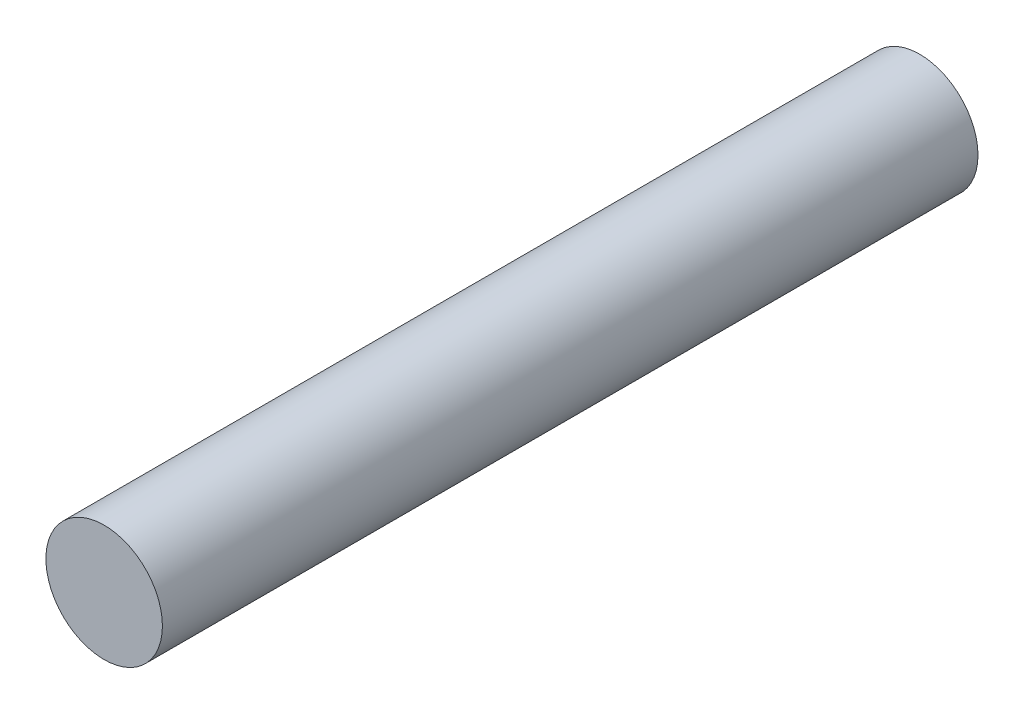
ISO-10303-21;
HEADER;
FILE_DESCRIPTION(('STEP AP214'),'2;1');
FILE_NAME('part.step','',(''),(''),'','','');
FILE_SCHEMA(('AUTOMOTIVE_DESIGN { 1 0 10303 214 1 1 1 1 }'));
ENDSEC;
DATA;
#1=APPLICATION_CONTEXT('core data for automotive mechanical design processes');
#2=APPLICATION_PROTOCOL_DEFINITION('international standard','automotive_design',2000,#1);
#3=PRODUCT_CONTEXT('',#1,'mechanical');
#4=PRODUCT('Part','Part','',(#3));
#5=PRODUCT_RELATED_PRODUCT_CATEGORY('part','',(#4));
#6=PRODUCT_DEFINITION_FORMATION('','',#4);
#7=PRODUCT_DEFINITION_CONTEXT('part definition',#1,'design');
#8=PRODUCT_DEFINITION('design','',#6,#7);
#9=PRODUCT_DEFINITION_SHAPE('','',#8);
#10=(LENGTH_UNIT() NAMED_UNIT(*) SI_UNIT(.MILLI.,.METRE.));
#11=(NAMED_UNIT(*) PLANE_ANGLE_UNIT() SI_UNIT($,.RADIAN.));
#12=(NAMED_UNIT(*) SI_UNIT($,.STERADIAN.) SOLID_ANGLE_UNIT());
#13=UNCERTAINTY_MEASURE_WITH_UNIT(LENGTH_MEASURE(1.E-05),#10,'distance_accuracy_value','');
#14=(GEOMETRIC_REPRESENTATION_CONTEXT(3) GLOBAL_UNCERTAINTY_ASSIGNED_CONTEXT((#13)) GLOBAL_UNIT_ASSIGNED_CONTEXT((#10,
#11,#12)) REPRESENTATION_CONTEXT('',''));
#15=CARTESIAN_POINT('',(0.,0.,0.));
#16=DIRECTION('',(0.,0.,1.));
#17=DIRECTION('',(1.,0.,0.));
#18=AXIS2_PLACEMENT_3D('',#15,#16,#17);
#19=CARTESIAN_POINT('',(0.,0.,42.));
#20=DIRECTION('',(0.,0.,-1.));
#21=DIRECTION('',(0.,-1.,0.));
#22=AXIS2_PLACEMENT_3D('',#19,#20,#21);
#23=CYLINDRICAL_SURFACE('',#22,3.);
#24=CARTESIAN_POINT('',(0.,0.,42.));
#25=DIRECTION('',(0.,0.,1.));
#26=DIRECTION('',(1.,0.,0.));
#27=AXIS2_PLACEMENT_3D('',#24,#25,#26);
#28=CIRCLE('',#27,3.);
#29=CARTESIAN_POINT('',(3.,0.,42.));
#30=VERTEX_POINT('',#29);
#31=EDGE_CURVE('E19',#30,#30,#28,.T.);
#32=ORIENTED_EDGE('',*,*,#31,.F.);
#33=EDGE_LOOP('',(#32));
#34=FACE_BOUND('',#33,.T.);
#35=CARTESIAN_POINT('',(0.,0.,0.));
#36=DIRECTION('',(0.,0.,1.));
#37=DIRECTION('',(1.,0.,0.));
#38=AXIS2_PLACEMENT_3D('',#35,#36,#37);
#39=CIRCLE('',#38,3.);
#40=CARTESIAN_POINT('',(3.,0.,0.));
#41=VERTEX_POINT('',#40);
#42=EDGE_CURVE('E8',#41,#41,#39,.T.);
#43=ORIENTED_EDGE('',*,*,#42,.T.);
#44=EDGE_LOOP('',(#43));
#45=FACE_BOUND('',#44,.T.);
#46=ADVANCED_FACE('F13',(#34,#45),#23,.T.);
#47=CARTESIAN_POINT('',(0.,0.,42.));
#48=DIRECTION('',(0.,0.,1.));
#49=DIRECTION('',(1.,0.,0.));
#50=AXIS2_PLACEMENT_3D('',#47,#48,#49);
#51=PLANE('',#50);
#52=ORIENTED_EDGE('',*,*,#31,.T.);
#53=EDGE_LOOP('',(#52));
#54=FACE_BOUND('',#53,.T.);
#55=ADVANCED_FACE('F25',(#54),#51,.T.);
#56=CARTESIAN_POINT('',(0.,0.,0.));
#57=DIRECTION('',(0.,0.,1.));
#58=DIRECTION('',(1.,0.,0.));
#59=AXIS2_PLACEMENT_3D('',#56,#57,#58);
#60=PLANE('',#59);
#61=ORIENTED_EDGE('',*,*,#42,.F.);
#62=EDGE_LOOP('',(#61));
#63=FACE_BOUND('',#62,.T.);
#64=ADVANCED_FACE('F32',(#63),#60,.F.);
#65=CLOSED_SHELL('',(#46,#55,#64));
#66=MANIFOLD_SOLID_BREP('B1',#65);
#67=ADVANCED_BREP_SHAPE_REPRESENTATION('',(#18,#66),#14);
#68=SHAPE_DEFINITION_REPRESENTATION(#9,#67);
ENDSEC;
END-ISO-10303-21;
